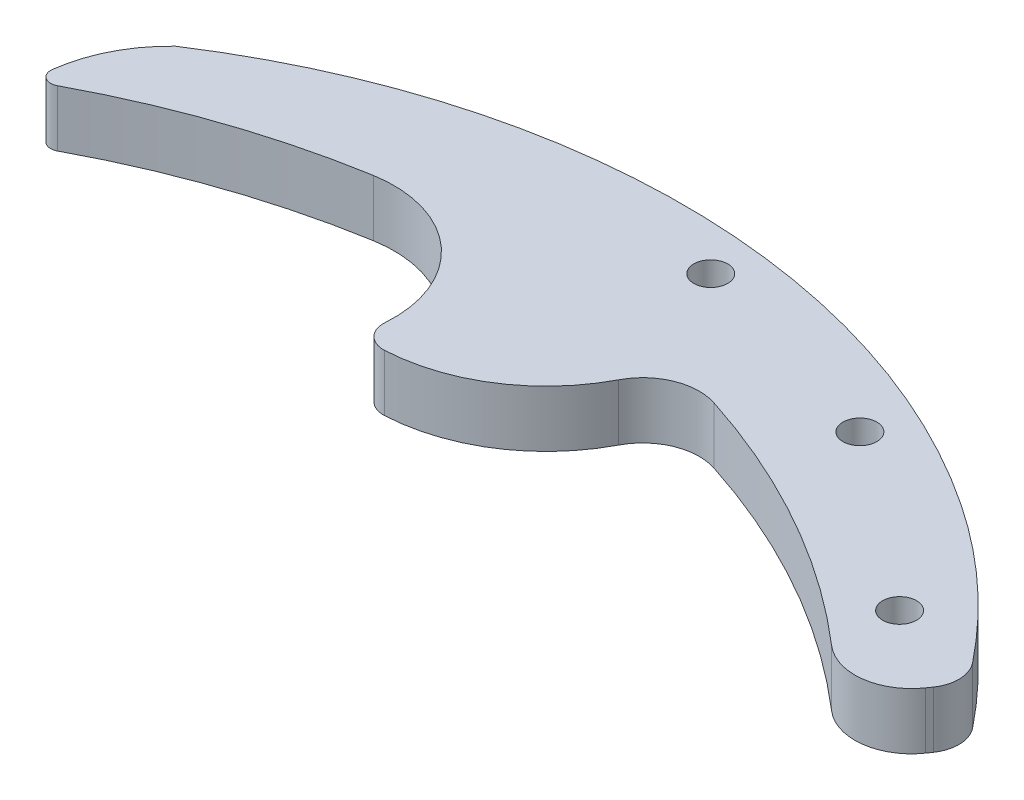
ISO-10303-21;
HEADER;
FILE_DESCRIPTION(('STEP AP214'),'2;1');
FILE_NAME('part.step','',(''),(''),'','','');
FILE_SCHEMA(('AUTOMOTIVE_DESIGN { 1 0 10303 214 1 1 1 1 }'));
ENDSEC;
DATA;
#1=APPLICATION_CONTEXT('core data for automotive mechanical design processes');
#2=APPLICATION_PROTOCOL_DEFINITION('international standard','automotive_design',2000,#1);
#3=PRODUCT_CONTEXT('',#1,'mechanical');
#4=PRODUCT('Part','Part','',(#3));
#5=PRODUCT_RELATED_PRODUCT_CATEGORY('part','',(#4));
#6=PRODUCT_DEFINITION_FORMATION('','',#4);
#7=PRODUCT_DEFINITION_CONTEXT('part definition',#1,'design');
#8=PRODUCT_DEFINITION('design','',#6,#7);
#9=PRODUCT_DEFINITION_SHAPE('','',#8);
#10=(LENGTH_UNIT() NAMED_UNIT(*) SI_UNIT(.MILLI.,.METRE.));
#11=(NAMED_UNIT(*) PLANE_ANGLE_UNIT() SI_UNIT($,.RADIAN.));
#12=(NAMED_UNIT(*) SI_UNIT($,.STERADIAN.) SOLID_ANGLE_UNIT());
#13=UNCERTAINTY_MEASURE_WITH_UNIT(LENGTH_MEASURE(1.E-05),#10,'distance_accuracy_value','');
#14=(GEOMETRIC_REPRESENTATION_CONTEXT(3) GLOBAL_UNCERTAINTY_ASSIGNED_CONTEXT((#13)) GLOBAL_UNIT_ASSIGNED_CONTEXT((#10,
#11,#12)) REPRESENTATION_CONTEXT('',''));
#15=CARTESIAN_POINT('',(0.,0.,0.));
#16=DIRECTION('',(0.,0.,1.));
#17=DIRECTION('',(1.,0.,0.));
#18=AXIS2_PLACEMENT_3D('',#15,#16,#17);
#19=CARTESIAN_POINT('',(-44.381584204746,-488.8,57.6991200372494));
#20=DIRECTION('',(0.,1.,0.));
#21=DIRECTION('',(0.,0.,1.));
#22=AXIS2_PLACEMENT_3D('',#19,#20,#21);
#23=CYLINDRICAL_SURFACE('',#22,68.5688354464655);
#24=CARTESIAN_POINT('',(-44.381584204746,11.2,57.6991200372494));
#25=DIRECTION('',(0.,1.,0.));
#26=DIRECTION('',(0.,0.,-1.));
#27=AXIS2_PLACEMENT_3D('',#24,#25,#26);
#28=CIRCLE('',#27,68.5688354464655);
#29=CARTESIAN_POINT('',(-55.7948873999185,11.2,-9.913169560571));
#30=VERTEX_POINT('',#29);
#31=CARTESIAN_POINT('',(-76.6368160318954,11.2,-2.80943484767008));
#32=VERTEX_POINT('',#31);
#33=EDGE_CURVE('E216',#30,#32,#28,.T.);
#34=ORIENTED_EDGE('',*,*,#33,.T.);
#35=DIRECTION('',(0.,1.,0.));
#36=VECTOR('',#35,1.);
#37=CARTESIAN_POINT('',(-76.6368160318954,-488.8,-2.80943484767008));
#38=LINE('',#37,#36);
#39=CARTESIAN_POINT('',(-76.6368160318954,6.19999999999998,-2.80943484767008));
#40=VERTEX_POINT('',#39);
#41=EDGE_CURVE('E43',#32,#40,#38,.F.);
#42=ORIENTED_EDGE('',*,*,#41,.T.);
#43=CARTESIAN_POINT('',(-44.381584204746,6.19999999999998,57.6991200372494));
#44=DIRECTION('',(0.,-1.,0.));
#45=DIRECTION('',(0.,0.,-1.));
#46=AXIS2_PLACEMENT_3D('',#43,#44,#45);
#47=CIRCLE('',#46,68.5688354464655);
#48=CARTESIAN_POINT('',(-55.7948873999185,6.2,-9.913169560571));
#49=VERTEX_POINT('',#48);
#50=EDGE_CURVE('E221',#40,#49,#47,.T.);
#51=ORIENTED_EDGE('',*,*,#50,.T.);
#52=DIRECTION('',(0.,1.,0.));
#53=VECTOR('',#52,1.);
#54=CARTESIAN_POINT('',(-55.7948873999185,-24.9234414513483,-9.913169560571));
#55=LINE('',#54,#53);
#56=EDGE_CURVE('E213',#49,#30,#55,.T.);
#57=ORIENTED_EDGE('',*,*,#56,.T.);
#58=EDGE_LOOP('',(#34,#42,#51,#57));
#59=FACE_BOUND('',#58,.T.);
#60=ADVANCED_FACE('F35',(#59),#23,.F.);
#61=CARTESIAN_POINT('',(8.14322778461929,1.2,4.50099487188552));
#62=DIRECTION('',(-0.822192191643795,0.,-0.569209978830285));
#63=DIRECTION('',(-0.569209978830285,0.,0.822192191643795));
#64=AXIS2_PLACEMENT_3D('',#61,#62,#63);
#65=PLANE('',#64);
#66=DIRECTION('',(0.569209978830287,0.,-0.822192191643793));
#67=VECTOR('',#66,1.);
#68=CARTESIAN_POINT('',(8.1432277846193,11.2,4.50099487188553));
#69=LINE('',#68,#67);
#70=CARTESIAN_POINT('',(7.86216285251633,11.2,4.90697755158983));
#71=VERTEX_POINT('',#70);
#72=CARTESIAN_POINT('',(8.1432277846193,11.2,4.50099487188553));
#73=VERTEX_POINT('',#72);
#74=EDGE_CURVE('E257',#71,#73,#69,.T.);
#75=ORIENTED_EDGE('',*,*,#74,.F.);
#76=DIRECTION('',(0.,1.,0.));
#77=VECTOR('',#76,1.);
#78=CARTESIAN_POINT('',(7.86216285251633,1.2,4.90697755158982));
#79=LINE('',#78,#77);
#80=CARTESIAN_POINT('',(7.86216285251632,6.2,4.90697755158983));
#81=VERTEX_POINT('',#80);
#82=EDGE_CURVE('E174',#71,#81,#79,.F.);
#83=ORIENTED_EDGE('',*,*,#82,.T.);
#84=DIRECTION('',(-0.569209978830285,0.,0.822192191643795));
#85=VECTOR('',#84,1.);
#86=CARTESIAN_POINT('',(8.14322778461929,6.2,4.50099487188552));
#87=LINE('',#86,#85);
#88=CARTESIAN_POINT('',(8.1432277846193,6.2,4.50099487188553));
#89=VERTEX_POINT('',#88);
#90=EDGE_CURVE('E231',#89,#81,#87,.T.);
#91=ORIENTED_EDGE('',*,*,#90,.F.);
#92=DIRECTION('',(0.,-1.,0.));
#93=VECTOR('',#92,1.);
#94=CARTESIAN_POINT('',(8.1432277846193,1.2,4.50099487188553));
#95=LINE('',#94,#93);
#96=EDGE_CURVE('E161',#73,#89,#95,.T.);
#97=ORIENTED_EDGE('',*,*,#96,.F.);
#98=EDGE_LOOP('',(#75,#83,#91,#97));
#99=FACE_BOUND('',#98,.T.);
#100=ADVANCED_FACE('F280',(#99),#65,.F.);
#101=CARTESIAN_POINT('',(5.67665120968791,1.2,2.79336493539468));
#102=DIRECTION('',(0.,-1.,0.));
#103=DIRECTION('',(0.,0.,-1.));
#104=AXIS2_PLACEMENT_3D('',#101,#102,#103);
#105=CYLINDRICAL_SURFACE('',#104,2.99999999999999);
#106=CARTESIAN_POINT('',(5.67665120968791,6.2,2.79336493539468));
#107=DIRECTION('',(0.,-1.,0.));
#108=DIRECTION('',(0.,0.,-1.));
#109=AXIS2_PLACEMENT_3D('',#106,#107,#108);
#110=CIRCLE('',#109,2.99999999999999);
#111=CARTESIAN_POINT('',(8.02129778197895,6.2,0.921832822113208));
#112=VERTEX_POINT('',#111);
#113=EDGE_CURVE('E229',#112,#89,#110,.T.);
#114=ORIENTED_EDGE('',*,*,#113,.F.);
#115=DIRECTION('',(0.,-1.,0.));
#116=VECTOR('',#115,1.);
#117=CARTESIAN_POINT('',(8.02129778197895,1.2,0.921832822113208));
#118=LINE('',#117,#116);
#119=CARTESIAN_POINT('',(8.02129778197896,11.2,0.921832822113208));
#120=VERTEX_POINT('',#119);
#121=EDGE_CURVE('E167',#120,#112,#118,.T.);
#122=ORIENTED_EDGE('',*,*,#121,.F.);
#123=CARTESIAN_POINT('',(5.67665120968792,11.2,2.79336493539469));
#124=DIRECTION('',(0.,1.,0.));
#125=DIRECTION('',(0.,0.,-1.));
#126=AXIS2_PLACEMENT_3D('',#123,#124,#125);
#127=CIRCLE('',#126,2.99999999999998);
#128=EDGE_CURVE('E249',#73,#120,#127,.T.);
#129=ORIENTED_EDGE('',*,*,#128,.F.);
#130=ORIENTED_EDGE('',*,*,#96,.T.);
#131=EDGE_LOOP('',(#114,#122,#129,#130));
#132=FACE_BOUND('',#131,.T.);
#133=ADVANCED_FACE('F276',(#132),#105,.T.);
#134=CARTESIAN_POINT('',(-35.7027580415051,1.2,35.8230309658508));
#135=DIRECTION('',(0.,-1.,0.));
#136=DIRECTION('',(0.,0.,-1.));
#137=AXIS2_PLACEMENT_3D('',#134,#135,#136);
#138=CYLINDRICAL_SURFACE('',#137,55.9453902437331);
#139=CARTESIAN_POINT('',(-35.7027580415051,6.2,35.8230309658508));
#140=DIRECTION('',(0.,-1.,0.));
#141=DIRECTION('',(0.,0.,-1.));
#142=AXIS2_PLACEMENT_3D('',#139,#140,#141);
#143=CIRCLE('',#142,55.9453902437331);
#144=CARTESIAN_POINT('',(-4.57488763843811,6.2,-10.6629064098056));
#145=VERTEX_POINT('',#144);
#146=EDGE_CURVE('E227',#145,#112,#143,.T.);
#147=ORIENTED_EDGE('',*,*,#146,.F.);
#148=DIRECTION('',(0.,-1.,0.));
#149=VECTOR('',#148,1.);
#150=CARTESIAN_POINT('',(-4.57488763843811,1.2,-10.6629064098056));
#151=LINE('',#150,#149);
#152=CARTESIAN_POINT('',(-4.57488763843811,11.2,-10.6629064098056));
#153=VERTEX_POINT('',#152);
#154=EDGE_CURVE('E259',#153,#145,#151,.T.);
#155=ORIENTED_EDGE('',*,*,#154,.F.);
#156=CARTESIAN_POINT('',(-35.7027580415043,11.2,35.8230309658499));
#157=DIRECTION('',(0.,1.,0.));
#158=DIRECTION('',(0.,0.,-1.));
#159=AXIS2_PLACEMENT_3D('',#156,#157,#158);
#160=CIRCLE('',#159,55.9453902437319);
#161=EDGE_CURVE('E252',#120,#153,#160,.T.);
#162=ORIENTED_EDGE('',*,*,#161,.F.);
#163=ORIENTED_EDGE('',*,*,#121,.T.);
#164=EDGE_LOOP('',(#147,#155,#162,#163));
#165=FACE_BOUND('',#164,.T.);
#166=ADVANCED_FACE('F270',(#165),#138,.T.);
#167=CARTESIAN_POINT('',(0.78303987745354,1.2,0.136157483073447));
#168=DIRECTION('',(0.,-1.,0.));
#169=DIRECTION('',(0.,0.,-1.));
#170=AXIS2_PLACEMENT_3D('',#167,#168,#169);
#171=CYLINDRICAL_SURFACE('',#170,1.50000000000011);
#172=CARTESIAN_POINT('',(0.78303987745354,11.1999999999997,0.136157483073447));
#173=DIRECTION('',(0.,-1.,0.));
#174=DIRECTION('',(0.,0.,-1.));
#175=AXIS2_PLACEMENT_3D('',#172,#173,#174);
#176=CIRCLE('',#175,1.50000000000011);
#177=CARTESIAN_POINT('',(0.78303987745354,11.1999999999997,-1.36384251692667));
#178=VERTEX_POINT('',#177);
#179=EDGE_CURVE('E246',#178,#178,#176,.T.);
#180=ORIENTED_EDGE('',*,*,#179,.F.);
#181=EDGE_LOOP('',(#180));
#182=FACE_BOUND('',#181,.T.);
#183=CARTESIAN_POINT('',(0.78303987745354,6.2,0.136157483073447));
#184=DIRECTION('',(0.,-1.,0.));
#185=DIRECTION('',(0.,0.,-1.));
#186=AXIS2_PLACEMENT_3D('',#183,#184,#185);
#187=CIRCLE('',#186,1.50000000000011);
#188=CARTESIAN_POINT('',(0.78303987745354,6.2,-1.36384251692667));
#189=VERTEX_POINT('',#188);
#190=EDGE_CURVE('E240',#189,#189,#187,.T.);
#191=ORIENTED_EDGE('',*,*,#190,.T.);
#192=EDGE_LOOP('',(#191));
#193=FACE_BOUND('',#192,.T.);
#194=ADVANCED_FACE('F344',(#182,#193),#171,.F.);
#195=CARTESIAN_POINT('',(-33.3547852261345,1.2,-17.3022086811354));
#196=DIRECTION('',(0.,-1.,0.));
#197=DIRECTION('',(0.,0.,-1.));
#198=AXIS2_PLACEMENT_3D('',#195,#196,#197);
#199=CYLINDRICAL_SURFACE('',#198,1.50000000000011);
#200=CARTESIAN_POINT('',(-33.3547852261345,11.2,-17.3022086811354));
#201=DIRECTION('',(0.,-1.,0.));
#202=DIRECTION('',(0.,0.,-1.));
#203=AXIS2_PLACEMENT_3D('',#200,#201,#202);
#204=CIRCLE('',#203,1.50000000000011);
#205=CARTESIAN_POINT('',(-33.3547852261345,11.2,-18.8022086811355));
#206=VERTEX_POINT('',#205);
#207=EDGE_CURVE('E243',#206,#206,#204,.T.);
#208=ORIENTED_EDGE('',*,*,#207,.F.);
#209=EDGE_LOOP('',(#208));
#210=FACE_BOUND('',#209,.T.);
#211=CARTESIAN_POINT('',(-33.3547852261345,6.2,-17.3022086811354));
#212=DIRECTION('',(0.,-1.,0.));
#213=DIRECTION('',(0.,0.,-1.));
#214=AXIS2_PLACEMENT_3D('',#211,#212,#213);
#215=CIRCLE('',#214,1.50000000000011);
#216=CARTESIAN_POINT('',(-33.3547852261345,6.2,-18.8022086811355));
#217=VERTEX_POINT('',#216);
#218=EDGE_CURVE('E237',#217,#217,#215,.T.);
#219=ORIENTED_EDGE('',*,*,#218,.T.);
#220=EDGE_LOOP('',(#219));
#221=FACE_BOUND('',#220,.T.);
#222=ADVANCED_FACE('F341',(#210,#221),#199,.F.);
#223=CARTESIAN_POINT('',(-39.8161013319415,11.2,41.9658417694121));
#224=DIRECTION('',(0.,-1.,0.));
#225=DIRECTION('',(0.,0.,-1.));
#226=AXIS2_PLACEMENT_3D('',#223,#224,#225);
#227=CYLINDRICAL_SURFACE('',#226,63.3382055121763);
#228=CARTESIAN_POINT('',(-39.8161013319415,6.2,41.9658417694121));
#229=DIRECTION('',(0.,-1.,0.));
#230=DIRECTION('',(0.,0.,-1.));
#231=AXIS2_PLACEMENT_3D('',#228,#229,#230);
#232=CIRCLE('',#231,63.3382055121763);
#233=CARTESIAN_POINT('',(-58.6398010049799,6.2,-18.5105718818779));
#234=VERTEX_POINT('',#233);
#235=EDGE_CURVE('E225',#234,#145,#232,.T.);
#236=ORIENTED_EDGE('',*,*,#235,.F.);
#237=DIRECTION('',(0.,1.,0.));
#238=VECTOR('',#237,1.);
#239=CARTESIAN_POINT('',(-58.6398010049799,-488.8,-18.5105718818779));
#240=LINE('',#239,#238);
#241=CARTESIAN_POINT('',(-58.6398010049799,11.2,-18.5105718818779));
#242=VERTEX_POINT('',#241);
#243=EDGE_CURVE('E159',#234,#242,#240,.T.);
#244=ORIENTED_EDGE('',*,*,#243,.T.);
#245=CARTESIAN_POINT('',(-39.8161013319415,11.2,41.9658417694121));
#246=DIRECTION('',(0.,1.,0.));
#247=DIRECTION('',(0.,0.,1.));
#248=AXIS2_PLACEMENT_3D('',#245,#246,#247);
#249=CIRCLE('',#248,63.3382055121763);
#250=EDGE_CURVE('E255',#153,#242,#249,.T.);
#251=ORIENTED_EDGE('',*,*,#250,.F.);
#252=ORIENTED_EDGE('',*,*,#154,.T.);
#253=EDGE_LOOP('',(#236,#244,#251,#252));
#254=FACE_BOUND('',#253,.T.);
#255=ADVANCED_FACE('F266',(#254),#227,.T.);
#256=CARTESIAN_POINT('',(-14.650535253278,500.,-11.7844071011678));
#257=DIRECTION('',(0.,-1.,0.));
#258=DIRECTION('',(0.,0.,-1.));
#259=AXIS2_PLACEMENT_3D('',#256,#257,#258);
#260=CYLINDRICAL_SURFACE('',#259,1.5);
#261=CARTESIAN_POINT('',(-14.650535253278,11.2,-11.7844071011678));
#262=DIRECTION('',(0.,-1.,0.));
#263=DIRECTION('',(0.,0.,-1.));
#264=AXIS2_PLACEMENT_3D('',#261,#262,#263);
#265=CIRCLE('',#264,1.5);
#266=CARTESIAN_POINT('',(-14.650535253278,11.2,-13.2844071011678));
#267=VERTEX_POINT('',#266);
#268=EDGE_CURVE('E170',#267,#267,#265,.T.);
#269=ORIENTED_EDGE('',*,*,#268,.F.);
#270=EDGE_LOOP('',(#269));
#271=FACE_BOUND('',#270,.T.);
#272=CARTESIAN_POINT('',(-14.650535253278,6.19999999999998,-11.7844071011678));
#273=DIRECTION('',(0.,-1.,0.));
#274=DIRECTION('',(0.,0.,-1.));
#275=AXIS2_PLACEMENT_3D('',#272,#273,#274);
#276=CIRCLE('',#275,1.5);
#277=CARTESIAN_POINT('',(-14.650535253278,6.19999999999998,-13.2844071011678));
#278=VERTEX_POINT('',#277);
#279=EDGE_CURVE('E234',#278,#278,#276,.F.);
#280=ORIENTED_EDGE('',*,*,#279,.F.);
#281=EDGE_LOOP('',(#280));
#282=FACE_BOUND('',#281,.T.);
#283=ADVANCED_FACE('F332',(#271,#282),#260,.F.);
#284=CARTESIAN_POINT('',(5.67665120968792,11.2,2.79336493539469));
#285=DIRECTION('',(0.,-1.,0.));
#286=DIRECTION('',(0.,0.,-1.));
#287=AXIS2_PLACEMENT_3D('',#284,#285,#286);
#288=PLANE('',#287);
#289=ORIENTED_EDGE('',*,*,#268,.T.);
#290=EDGE_LOOP('',(#289));
#291=FACE_BOUND('',#290,.T.);
#292=ORIENTED_EDGE('',*,*,#207,.T.);
#293=EDGE_LOOP('',(#292));
#294=FACE_BOUND('',#293,.T.);
#295=ORIENTED_EDGE('',*,*,#179,.T.);
#296=EDGE_LOOP('',(#295));
#297=FACE_BOUND('',#296,.T.);
#298=CARTESIAN_POINT('',(-66.1331984309525,11.2,-2.30958050249402));
#299=DIRECTION('',(0.,-1.,0.));
#300=DIRECTION('',(0.,0.,1.));
#301=AXIS2_PLACEMENT_3D('',#298,#299,#300);
#302=CIRCLE('',#301,12.0607401021846);
#303=CARTESIAN_POINT('',(-78.0993826444742,11.2,-3.81685857256184));
#304=VERTEX_POINT('',#303);
#305=CARTESIAN_POINT('',(-74.4382686598451,11.2,-11.0552800345843));
#306=VERTEX_POINT('',#305);
#307=EDGE_CURVE('E141',#304,#306,#302,.T.);
#308=ORIENTED_EDGE('',*,*,#307,.F.);
#309=CARTESIAN_POINT('',(-77.107222618461,11.2,-3.69188464415468));
#310=DIRECTION('',(0.,-1.,0.));
#311=DIRECTION('',(0.,0.,-1.));
#312=AXIS2_PLACEMENT_3D('',#309,#310,#311);
#313=CIRCLE('',#312,1.);
#314=EDGE_CURVE('E57',#304,#32,#313,.F.);
#315=ORIENTED_EDGE('',*,*,#314,.T.);
#316=ORIENTED_EDGE('',*,*,#33,.F.);
#317=CARTESIAN_POINT('',(-54.1085217993102,11.2,0.0768427440486601));
#318=DIRECTION('',(0.,-1.,0.));
#319=DIRECTION('',(0.,0.,-1.));
#320=AXIS2_PLACEMENT_3D('',#317,#318,#319);
#321=CIRCLE('',#320,10.1313461487291);
#322=CARTESIAN_POINT('',(-44.0058847911477,11.2,0.839010879483154));
#323=VERTEX_POINT('',#322);
#324=EDGE_CURVE('E155',#30,#323,#321,.T.);
#325=ORIENTED_EDGE('',*,*,#324,.T.);
#326=CARTESIAN_POINT('',(-42.0115521802873,11.2,0.989468306215159));
#327=DIRECTION('',(0.,-1.,0.));
#328=DIRECTION('',(0.,0.,-1.));
#329=AXIS2_PLACEMENT_3D('',#326,#327,#328);
#330=CIRCLE('',#329,2.);
#331=CARTESIAN_POINT('',(-41.909077827667,11.2,2.9868413327315));
#332=VERTEX_POINT('',#331);
#333=EDGE_CURVE('E192',#323,#332,#330,.F.);
#334=ORIENTED_EDGE('',*,*,#333,.T.);
#335=CARTESIAN_POINT('',(-42.6824268968898,11.2,-12.0868481461486));
#336=DIRECTION('',(0.,1.,0.));
#337=DIRECTION('',(0.,0.,1.));
#338=AXIS2_PLACEMENT_3D('',#335,#336,#337);
#339=CIRCLE('',#338,15.0935146102082);
#340=CARTESIAN_POINT('',(-29.2979700948535,11.2,-5.11042360323332));
#341=VERTEX_POINT('',#340);
#342=EDGE_CURVE('E204',#332,#341,#339,.T.);
#343=ORIENTED_EDGE('',*,*,#342,.T.);
#344=CARTESIAN_POINT('',(-24.8641264382594,11.2,-2.79935665723623));
#345=DIRECTION('',(0.,-1.,0.));
#346=DIRECTION('',(0.,0.,-1.));
#347=AXIS2_PLACEMENT_3D('',#344,#345,#346);
#348=CIRCLE('',#347,5.);
#349=CARTESIAN_POINT('',(-23.328982870707,11.2,-7.55785791572117));
#350=VERTEX_POINT('',#349);
#351=EDGE_CURVE('E184',#341,#350,#348,.T.);
#352=ORIENTED_EDGE('',*,*,#351,.T.);
#353=CARTESIAN_POINT('',(0.479926373423527,11.2,5.84229731227667));
#354=VERTEX_POINT('',#353);
#355=EDGE_CURVE('E217',#354,#350,#28,.T.);
#356=ORIENTED_EDGE('',*,*,#355,.F.);
#357=CARTESIAN_POINT('',(3.75120189429735,11.2,2.06092765743839));
#358=DIRECTION('',(0.,-1.,0.));
#359=DIRECTION('',(0.,0.,-1.));
#360=AXIS2_PLACEMENT_3D('',#357,#358,#359);
#361=CIRCLE('',#360,5.);
#362=EDGE_CURVE('E164',#354,#71,#361,.F.);
#363=ORIENTED_EDGE('',*,*,#362,.T.);
#364=ORIENTED_EDGE('',*,*,#74,.T.);
#365=ORIENTED_EDGE('',*,*,#128,.T.);
#366=ORIENTED_EDGE('',*,*,#161,.T.);
#367=ORIENTED_EDGE('',*,*,#250,.T.);
#368=CARTESIAN_POINT('',(-39.6096070230907,11.2,42.2830753364119));
#369=DIRECTION('',(0.,-1.,0.));
#370=DIRECTION('',(0.,0.,1.));
#371=AXIS2_PLACEMENT_3D('',#368,#369,#370);
#372=CIRCLE('',#371,63.7025574454449);
#373=EDGE_CURVE('E201',#306,#242,#372,.T.);
#374=ORIENTED_EDGE('',*,*,#373,.F.);
#375=EDGE_LOOP('',(#308,#315,#316,#325,#334,#343,#352,#356,#363,#364,#365,#366,#367,#374));
#376=FACE_BOUND('',#375,.T.);
#377=ADVANCED_FACE('F199',(#291,#294,#297,#376),#288,.F.);
#378=CARTESIAN_POINT('',(0.,6.2,0.));
#379=DIRECTION('',(0.,-1.,0.));
#380=DIRECTION('',(0.,0.,-1.));
#381=AXIS2_PLACEMENT_3D('',#378,#379,#380);
#382=PLANE('',#381);
#383=ORIENTED_EDGE('',*,*,#50,.F.);
#384=CARTESIAN_POINT('',(-77.107222618461,6.19999999999998,-3.69188464415468));
#385=DIRECTION('',(0.,-1.,0.));
#386=DIRECTION('',(0.,0.,-1.));
#387=AXIS2_PLACEMENT_3D('',#384,#385,#386);
#388=CIRCLE('',#387,1.);
#389=CARTESIAN_POINT('',(-78.0993826444742,6.2,-3.81685857256184));
#390=VERTEX_POINT('',#389);
#391=EDGE_CURVE('E11',#40,#390,#388,.T.);
#392=ORIENTED_EDGE('',*,*,#391,.T.);
#393=CARTESIAN_POINT('',(-66.1331984309525,6.2,-2.30958050249402));
#394=DIRECTION('',(0.,-1.,0.));
#395=DIRECTION('',(0.,0.,-1.));
#396=AXIS2_PLACEMENT_3D('',#393,#394,#395);
#397=CIRCLE('',#396,12.0607401021846);
#398=CARTESIAN_POINT('',(-74.4382686598451,6.19999999999998,-11.0552800345843));
#399=VERTEX_POINT('',#398);
#400=EDGE_CURVE('E139',#399,#390,#397,.F.);
#401=ORIENTED_EDGE('',*,*,#400,.F.);
#402=CARTESIAN_POINT('',(-39.6096070230907,6.19999999999998,42.2830753364119));
#403=DIRECTION('',(0.,-1.,0.));
#404=DIRECTION('',(0.,0.,-1.));
#405=AXIS2_PLACEMENT_3D('',#402,#403,#404);
#406=CIRCLE('',#405,63.7025574454449);
#407=EDGE_CURVE('E152',#234,#399,#406,.F.);
#408=ORIENTED_EDGE('',*,*,#407,.F.);
#409=ORIENTED_EDGE('',*,*,#235,.T.);
#410=ORIENTED_EDGE('',*,*,#146,.T.);
#411=ORIENTED_EDGE('',*,*,#113,.T.);
#412=ORIENTED_EDGE('',*,*,#90,.T.);
#413=CARTESIAN_POINT('',(3.75120189429735,6.19999999999998,2.06092765743839));
#414=DIRECTION('',(0.,-1.,0.));
#415=DIRECTION('',(0.,0.,-1.));
#416=AXIS2_PLACEMENT_3D('',#413,#414,#415);
#417=CIRCLE('',#416,5.);
#418=CARTESIAN_POINT('',(0.479926373423527,6.19999999999998,5.84229731227667));
#419=VERTEX_POINT('',#418);
#420=EDGE_CURVE('E176',#81,#419,#417,.T.);
#421=ORIENTED_EDGE('',*,*,#420,.T.);
#422=CARTESIAN_POINT('',(-23.328982870707,6.19999999999998,-7.55785791572117));
#423=VERTEX_POINT('',#422);
#424=EDGE_CURVE('E220',#423,#419,#47,.T.);
#425=ORIENTED_EDGE('',*,*,#424,.F.);
#426=CARTESIAN_POINT('',(-24.8641264382594,6.19999999999998,-2.79935665723623));
#427=DIRECTION('',(0.,-1.,0.));
#428=DIRECTION('',(0.,0.,-1.));
#429=AXIS2_PLACEMENT_3D('',#426,#427,#428);
#430=CIRCLE('',#429,5.);
#431=CARTESIAN_POINT('',(-29.2979700948535,6.2,-5.11042360323332));
#432=VERTEX_POINT('',#431);
#433=EDGE_CURVE('E186',#423,#432,#430,.F.);
#434=ORIENTED_EDGE('',*,*,#433,.T.);
#435=CARTESIAN_POINT('',(-42.6824268968898,6.2,-12.0868481461486));
#436=DIRECTION('',(0.,-1.,0.));
#437=DIRECTION('',(0.,0.,-1.));
#438=AXIS2_PLACEMENT_3D('',#435,#436,#437);
#439=CIRCLE('',#438,15.0935146102082);
#440=CARTESIAN_POINT('',(-41.909077827667,6.2,2.9868413327315));
#441=VERTEX_POINT('',#440);
#442=EDGE_CURVE('E211',#441,#432,#439,.F.);
#443=ORIENTED_EDGE('',*,*,#442,.F.);
#444=CARTESIAN_POINT('',(-42.0115521802873,6.2,0.989468306215159));
#445=DIRECTION('',(0.,-1.,0.));
#446=DIRECTION('',(0.,0.,-1.));
#447=AXIS2_PLACEMENT_3D('',#444,#445,#446);
#448=CIRCLE('',#447,2.);
#449=CARTESIAN_POINT('',(-44.0058847911477,6.2,0.839010879483154));
#450=VERTEX_POINT('',#449);
#451=EDGE_CURVE('E146',#441,#450,#448,.T.);
#452=ORIENTED_EDGE('',*,*,#451,.T.);
#453=CARTESIAN_POINT('',(-54.1085217993102,6.2,0.0768427440486601));
#454=DIRECTION('',(0.,-1.,0.));
#455=DIRECTION('',(0.,0.,-1.));
#456=AXIS2_PLACEMENT_3D('',#453,#454,#455);
#457=CIRCLE('',#456,10.1313461487291);
#458=EDGE_CURVE('E206',#49,#450,#457,.T.);
#459=ORIENTED_EDGE('',*,*,#458,.F.);
#460=EDGE_LOOP('',(#383,#392,#401,#408,#409,#410,#411,#412,#421,#425,#434,#443,#452,#459));
#461=FACE_BOUND('',#460,.T.);
#462=ORIENTED_EDGE('',*,*,#190,.F.);
#463=EDGE_LOOP('',(#462));
#464=FACE_BOUND('',#463,.T.);
#465=ORIENTED_EDGE('',*,*,#218,.F.);
#466=EDGE_LOOP('',(#465));
#467=FACE_BOUND('',#466,.T.);
#468=ORIENTED_EDGE('',*,*,#279,.T.);
#469=EDGE_LOOP('',(#468));
#470=FACE_BOUND('',#469,.T.);
#471=ADVANCED_FACE('F150',(#461,#464,#467,#470),#382,.T.);
#472=CARTESIAN_POINT('',(-39.6096070230907,-488.8,42.2830753364119));
#473=DIRECTION('',(0.,1.,0.));
#474=DIRECTION('',(0.,0.,1.));
#475=AXIS2_PLACEMENT_3D('',#472,#473,#474);
#476=CYLINDRICAL_SURFACE('',#475,63.7025574454449);
#477=ORIENTED_EDGE('',*,*,#407,.T.);
#478=DIRECTION('',(0.,1.,0.));
#479=VECTOR('',#478,1.);
#480=CARTESIAN_POINT('',(-74.4382686598451,-13.8,-11.0552800345843));
#481=LINE('',#480,#479);
#482=EDGE_CURVE('E135',#399,#306,#481,.T.);
#483=ORIENTED_EDGE('',*,*,#482,.T.);
#484=ORIENTED_EDGE('',*,*,#373,.T.);
#485=ORIENTED_EDGE('',*,*,#243,.F.);
#486=EDGE_LOOP('',(#477,#483,#484,#485));
#487=FACE_BOUND('',#486,.T.);
#488=ADVANCED_FACE('F157',(#487),#476,.T.);
#489=ORIENTED_EDGE('',*,*,#355,.T.);
#490=DIRECTION('',(0.,1.,0.));
#491=VECTOR('',#490,1.);
#492=CARTESIAN_POINT('',(-23.328982870707,-488.8,-7.55785791572117));
#493=LINE('',#492,#491);
#494=EDGE_CURVE('E182',#350,#423,#493,.F.);
#495=ORIENTED_EDGE('',*,*,#494,.T.);
#496=ORIENTED_EDGE('',*,*,#424,.T.);
#497=DIRECTION('',(0.,1.,0.));
#498=VECTOR('',#497,1.);
#499=CARTESIAN_POINT('',(0.479926373423534,-488.8,5.84229731227667));
#500=LINE('',#499,#498);
#501=EDGE_CURVE('E160',#419,#354,#500,.T.);
#502=ORIENTED_EDGE('',*,*,#501,.T.);
#503=EDGE_LOOP('',(#489,#495,#496,#502));
#504=FACE_BOUND('',#503,.T.);
#505=ADVANCED_FACE('F313',(#504),#23,.F.);
#506=CARTESIAN_POINT('',(3.75120189429735,-488.8,2.06092765743839));
#507=DIRECTION('',(0.,1.,0.));
#508=DIRECTION('',(0.,0.,1.));
#509=AXIS2_PLACEMENT_3D('',#506,#507,#508);
#510=CYLINDRICAL_SURFACE('',#509,5.);
#511=ORIENTED_EDGE('',*,*,#420,.F.);
#512=ORIENTED_EDGE('',*,*,#82,.F.);
#513=ORIENTED_EDGE('',*,*,#362,.F.);
#514=ORIENTED_EDGE('',*,*,#501,.F.);
#515=EDGE_LOOP('',(#511,#512,#513,#514));
#516=FACE_BOUND('',#515,.T.);
#517=ADVANCED_FACE('F283',(#516),#510,.T.);
#518=CARTESIAN_POINT('',(-54.1085217993102,-24.9234414513483,0.0768427440486601));
#519=DIRECTION('',(0.,1.,0.));
#520=DIRECTION('',(0.,0.,1.));
#521=AXIS2_PLACEMENT_3D('',#518,#519,#520);
#522=CYLINDRICAL_SURFACE('',#521,10.1313461487291);
#523=ORIENTED_EDGE('',*,*,#458,.T.);
#524=DIRECTION('',(0.,1.,0.));
#525=VECTOR('',#524,1.);
#526=CARTESIAN_POINT('',(-44.0058847911477,-24.9234414513483,0.839010879483154));
#527=LINE('',#526,#525);
#528=EDGE_CURVE('E189',#450,#323,#527,.T.);
#529=ORIENTED_EDGE('',*,*,#528,.T.);
#530=ORIENTED_EDGE('',*,*,#324,.F.);
#531=ORIENTED_EDGE('',*,*,#56,.F.);
#532=EDGE_LOOP('',(#523,#529,#530,#531));
#533=FACE_BOUND('',#532,.T.);
#534=ADVANCED_FACE('F304',(#533),#522,.F.);
#535=CARTESIAN_POINT('',(-42.6824268968898,-24.9234414513483,-12.0868481461486));
#536=DIRECTION('',(0.,1.,0.));
#537=DIRECTION('',(0.,0.,1.));
#538=AXIS2_PLACEMENT_3D('',#535,#536,#537);
#539=CYLINDRICAL_SURFACE('',#538,15.0935146102082);
#540=ORIENTED_EDGE('',*,*,#342,.F.);
#541=DIRECTION('',(0.,1.,0.));
#542=VECTOR('',#541,1.);
#543=CARTESIAN_POINT('',(-41.909077827667,-24.9234414513483,2.9868413327315));
#544=LINE('',#543,#542);
#545=EDGE_CURVE('E194',#332,#441,#544,.F.);
#546=ORIENTED_EDGE('',*,*,#545,.T.);
#547=ORIENTED_EDGE('',*,*,#442,.T.);
#548=DIRECTION('',(0.,1.,0.));
#549=VECTOR('',#548,1.);
#550=CARTESIAN_POINT('',(-29.2979700948535,-24.9234414513483,-5.11042360323332));
#551=LINE('',#550,#549);
#552=EDGE_CURVE('E179',#432,#341,#551,.T.);
#553=ORIENTED_EDGE('',*,*,#552,.T.);
#554=EDGE_LOOP('',(#540,#546,#547,#553));
#555=FACE_BOUND('',#554,.T.);
#556=ADVANCED_FACE('F296',(#555),#539,.T.);
#557=CARTESIAN_POINT('',(-24.8641264382594,-488.8,-2.79935665723623));
#558=DIRECTION('',(0.,1.,0.));
#559=DIRECTION('',(0.,0.,1.));
#560=AXIS2_PLACEMENT_3D('',#557,#558,#559);
#561=CYLINDRICAL_SURFACE('',#560,5.);
#562=ORIENTED_EDGE('',*,*,#433,.F.);
#563=ORIENTED_EDGE('',*,*,#494,.F.);
#564=ORIENTED_EDGE('',*,*,#351,.F.);
#565=ORIENTED_EDGE('',*,*,#552,.F.);
#566=EDGE_LOOP('',(#562,#563,#564,#565));
#567=FACE_BOUND('',#566,.T.);
#568=ADVANCED_FACE('F292',(#567),#561,.F.);
#569=CARTESIAN_POINT('',(-42.0115521802873,-24.9234414513483,0.989468306215159));
#570=DIRECTION('',(0.,-1.,0.));
#571=DIRECTION('',(0.,0.,-1.));
#572=AXIS2_PLACEMENT_3D('',#569,#570,#571);
#573=CYLINDRICAL_SURFACE('',#572,2.);
#574=ORIENTED_EDGE('',*,*,#451,.F.);
#575=ORIENTED_EDGE('',*,*,#545,.F.);
#576=ORIENTED_EDGE('',*,*,#333,.F.);
#577=ORIENTED_EDGE('',*,*,#528,.F.);
#578=EDGE_LOOP('',(#574,#575,#576,#577));
#579=FACE_BOUND('',#578,.T.);
#580=ADVANCED_FACE('F302',(#579),#573,.T.);
#581=CARTESIAN_POINT('',(-66.1331984309525,-38.8,-2.30958050249402));
#582=DIRECTION('',(0.,1.,0.));
#583=DIRECTION('',(0.,0.,1.));
#584=AXIS2_PLACEMENT_3D('',#581,#582,#583);
#585=CYLINDRICAL_SURFACE('',#584,12.0607401021846);
#586=ORIENTED_EDGE('',*,*,#400,.T.);
#587=DIRECTION('',(0.,1.,0.));
#588=VECTOR('',#587,1.);
#589=CARTESIAN_POINT('',(-78.0993826444742,-38.8,-3.81685857256184));
#590=LINE('',#589,#588);
#591=EDGE_CURVE('E145',#390,#304,#590,.T.);
#592=ORIENTED_EDGE('',*,*,#591,.T.);
#593=ORIENTED_EDGE('',*,*,#307,.T.);
#594=ORIENTED_EDGE('',*,*,#482,.F.);
#595=EDGE_LOOP('',(#586,#592,#593,#594));
#596=FACE_BOUND('',#595,.T.);
#597=ADVANCED_FACE('F137',(#596),#585,.T.);
#598=CARTESIAN_POINT('',(-77.107222618461,-488.8,-3.69188464415468));
#599=DIRECTION('',(0.,-1.,0.));
#600=DIRECTION('',(0.,0.,-1.));
#601=AXIS2_PLACEMENT_3D('',#598,#599,#600);
#602=CYLINDRICAL_SURFACE('',#601,1.);
#603=ORIENTED_EDGE('',*,*,#391,.F.);
#604=ORIENTED_EDGE('',*,*,#41,.F.);
#605=ORIENTED_EDGE('',*,*,#314,.F.);
#606=ORIENTED_EDGE('',*,*,#591,.F.);
#607=EDGE_LOOP('',(#603,#604,#605,#606));
#608=FACE_BOUND('',#607,.T.);
#609=ADVANCED_FACE('F37',(#608),#602,.T.);
#610=CLOSED_SHELL('',(#60,#100,#133,#166,#194,#222,#255,#283,#377,#471,#488,#505,#517,#534,#556,
#568,#580,#597,#609));
#611=MANIFOLD_SOLID_BREP('B2',#610);
#612=ADVANCED_BREP_SHAPE_REPRESENTATION('',(#18,#611),#14);
#613=SHAPE_DEFINITION_REPRESENTATION(#9,#612);
ENDSEC;
END-ISO-10303-21;
